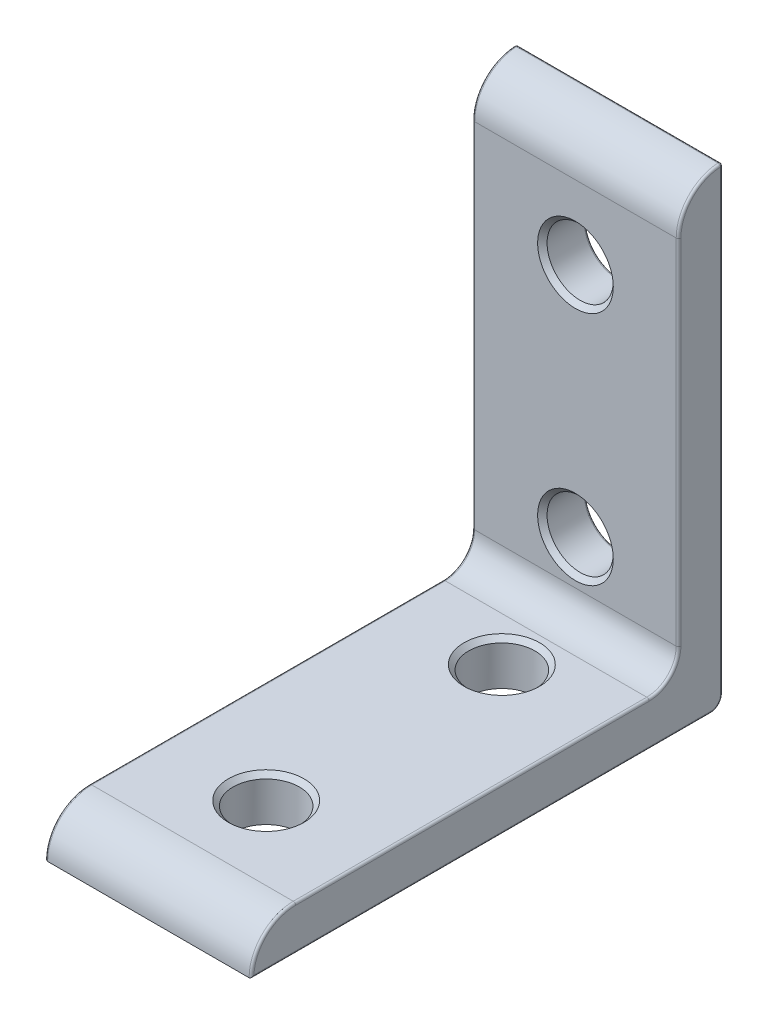
ISO-10303-21;
HEADER;
FILE_DESCRIPTION(('STEP AP214'),'2;1');
FILE_NAME('part.step','',(''),(''),'','','');
FILE_SCHEMA(('AUTOMOTIVE_DESIGN { 1 0 10303 214 1 1 1 1 }'));
ENDSEC;
DATA;
#1=APPLICATION_CONTEXT('core data for automotive mechanical design processes');
#2=APPLICATION_PROTOCOL_DEFINITION('international standard','automotive_design',2000,#1);
#3=PRODUCT_CONTEXT('',#1,'mechanical');
#4=PRODUCT('Part','Part','',(#3));
#5=PRODUCT_RELATED_PRODUCT_CATEGORY('part','',(#4));
#6=PRODUCT_DEFINITION_FORMATION('','',#4);
#7=PRODUCT_DEFINITION_CONTEXT('part definition',#1,'design');
#8=PRODUCT_DEFINITION('design','',#6,#7);
#9=PRODUCT_DEFINITION_SHAPE('','',#8);
#10=(LENGTH_UNIT() NAMED_UNIT(*) SI_UNIT(.MILLI.,.METRE.));
#11=(NAMED_UNIT(*) PLANE_ANGLE_UNIT() SI_UNIT($,.RADIAN.));
#12=(NAMED_UNIT(*) SI_UNIT($,.STERADIAN.) SOLID_ANGLE_UNIT());
#13=UNCERTAINTY_MEASURE_WITH_UNIT(LENGTH_MEASURE(1.E-05),#10,'distance_accuracy_value','');
#14=(GEOMETRIC_REPRESENTATION_CONTEXT(3) GLOBAL_UNCERTAINTY_ASSIGNED_CONTEXT((#13)) GLOBAL_UNIT_ASSIGNED_CONTEXT((#10,
#11,#12)) REPRESENTATION_CONTEXT('',''));
#15=CARTESIAN_POINT('',(0.,0.,0.));
#16=DIRECTION('',(0.,0.,1.));
#17=DIRECTION('',(1.,0.,0.));
#18=AXIS2_PLACEMENT_3D('',#15,#16,#17);
#19=CARTESIAN_POINT('',(-11.1125,-25.4,41.275));
#20=DIRECTION('',(1.,0.,0.));
#21=DIRECTION('',(0.,0.,-1.));
#22=AXIS2_PLACEMENT_3D('',#19,#20,#21);
#23=CYLINDRICAL_SURFACE('',#22,4.7625);
#24=DIRECTION('',(1.,0.,0.));
#25=VECTOR('',#24,1.);
#26=CARTESIAN_POINT('',(-11.1125,-20.6375,41.275));
#27=LINE('',#26,#25);
#28=CARTESIAN_POINT('',(-10.8585,-20.6375,41.275));
#29=VERTEX_POINT('',#28);
#30=CARTESIAN_POINT('',(10.8585,-20.6375,41.275));
#31=VERTEX_POINT('',#30);
#32=EDGE_CURVE('E203',#29,#31,#27,.T.);
#33=ORIENTED_EDGE('',*,*,#32,.F.);
#34=CARTESIAN_POINT('',(-10.8585,-25.4,41.275));
#35=DIRECTION('',(1.,0.,0.));
#36=DIRECTION('',(0.,0.,-1.));
#37=AXIS2_PLACEMENT_3D('',#34,#35,#36);
#38=CIRCLE('',#37,4.7625);
#39=CARTESIAN_POINT('',(-10.8585,-25.4,46.0375));
#40=VERTEX_POINT('',#39);
#41=EDGE_CURVE('E317',#29,#40,#38,.T.);
#42=ORIENTED_EDGE('',*,*,#41,.T.);
#43=DIRECTION('',(1.,0.,0.));
#44=VECTOR('',#43,1.);
#45=CARTESIAN_POINT('',(-11.1125,-25.4,46.0375));
#46=LINE('',#45,#44);
#47=CARTESIAN_POINT('',(10.8585,-25.4,46.0375));
#48=VERTEX_POINT('',#47);
#49=EDGE_CURVE('E193',#40,#48,#46,.T.);
#50=ORIENTED_EDGE('',*,*,#49,.T.);
#51=CARTESIAN_POINT('',(10.8585,-25.4,41.275));
#52=DIRECTION('',(1.,0.,0.));
#53=DIRECTION('',(0.,0.,-1.));
#54=AXIS2_PLACEMENT_3D('',#51,#52,#53);
#55=CIRCLE('',#54,4.7625);
#56=EDGE_CURVE('E314',#48,#31,#55,.F.);
#57=ORIENTED_EDGE('',*,*,#56,.T.);
#58=EDGE_LOOP('',(#33,#42,#50,#57));
#59=FACE_BOUND('',#58,.T.);
#60=ADVANCED_FACE('F41',(#59),#23,.T.);
#61=CARTESIAN_POINT('',(-11.1125,-20.6375,3.17499999999999));
#62=DIRECTION('',(0.,1.,0.));
#63=DIRECTION('',(0.,0.,1.));
#64=AXIS2_PLACEMENT_3D('',#61,#62,#63);
#65=PLANE('',#64);
#66=CARTESIAN_POINT('',(0.,-20.6375,33.3375));
#67=DIRECTION('',(0.,1.,0.));
#68=DIRECTION('',(0.,0.,1.));
#69=AXIS2_PLACEMENT_3D('',#66,#67,#68);
#70=CIRCLE('',#69,4.07670000000001);
#71=CARTESIAN_POINT('',(0.,-20.6375,37.4142));
#72=VERTEX_POINT('',#71);
#73=EDGE_CURVE('E247',#72,#72,#70,.F.);
#74=ORIENTED_EDGE('',*,*,#73,.T.);
#75=EDGE_LOOP('',(#74));
#76=FACE_BOUND('',#75,.T.);
#77=CARTESIAN_POINT('',(0.,-20.6375,7.9375));
#78=DIRECTION('',(0.,1.,0.));
#79=DIRECTION('',(0.,0.,1.));
#80=AXIS2_PLACEMENT_3D('',#77,#78,#79);
#81=CIRCLE('',#80,4.07670000000001);
#82=CARTESIAN_POINT('',(0.,-20.6375,12.0142));
#83=VERTEX_POINT('',#82);
#84=EDGE_CURVE('E243',#83,#83,#81,.F.);
#85=ORIENTED_EDGE('',*,*,#84,.T.);
#86=EDGE_LOOP('',(#85));
#87=FACE_BOUND('',#86,.T.);
#88=DIRECTION('',(1.,0.,0.));
#89=VECTOR('',#88,1.);
#90=CARTESIAN_POINT('',(-11.1125,-20.6375,3.17499999999999));
#91=LINE('',#90,#89);
#92=CARTESIAN_POINT('',(-10.8585,-20.6375,3.17499999999999));
#93=VERTEX_POINT('',#92);
#94=CARTESIAN_POINT('',(10.8585,-20.6375,3.17499999999999));
#95=VERTEX_POINT('',#94);
#96=EDGE_CURVE('E211',#93,#95,#91,.T.);
#97=ORIENTED_EDGE('',*,*,#96,.F.);
#98=DIRECTION('',(0.,0.,1.));
#99=VECTOR('',#98,1.);
#100=CARTESIAN_POINT('',(-10.8585,-20.6375,41.275));
#101=LINE('',#100,#99);
#102=EDGE_CURVE('E323',#93,#29,#101,.T.);
#103=ORIENTED_EDGE('',*,*,#102,.T.);
#104=ORIENTED_EDGE('',*,*,#32,.T.);
#105=DIRECTION('',(0.,0.,1.));
#106=VECTOR('',#105,1.);
#107=CARTESIAN_POINT('',(10.8585,-20.6375,3.17499999999999));
#108=LINE('',#107,#106);
#109=EDGE_CURVE('E320',#31,#95,#108,.F.);
#110=ORIENTED_EDGE('',*,*,#109,.T.);
#111=EDGE_LOOP('',(#97,#103,#104,#110));
#112=FACE_BOUND('',#111,.T.);
#113=ADVANCED_FACE('F551',(#76,#87,#112),#65,.T.);
#114=CARTESIAN_POINT('',(-11.1125,-17.4625,3.17499999999999));
#115=DIRECTION('',(1.,0.,0.));
#116=DIRECTION('',(0.,0.,-1.));
#117=AXIS2_PLACEMENT_3D('',#114,#115,#116);
#118=CYLINDRICAL_SURFACE('',#117,3.175);
#119=DIRECTION('',(1.,0.,0.));
#120=VECTOR('',#119,1.);
#121=CARTESIAN_POINT('',(-11.1125,-17.4625,0.));
#122=LINE('',#121,#120);
#123=CARTESIAN_POINT('',(-10.8585,-17.4625,0.));
#124=VERTEX_POINT('',#123);
#125=CARTESIAN_POINT('',(10.8585,-17.4625,0.));
#126=VERTEX_POINT('',#125);
#127=EDGE_CURVE('E556',#124,#126,#122,.T.);
#128=ORIENTED_EDGE('',*,*,#127,.F.);
#129=CARTESIAN_POINT('',(-10.8585,-17.4625,3.17499999999999));
#130=DIRECTION('',(1.,0.,0.));
#131=DIRECTION('',(0.,0.,-1.));
#132=AXIS2_PLACEMENT_3D('',#129,#130,#131);
#133=CIRCLE('',#132,3.175);
#134=EDGE_CURVE('E329',#124,#93,#133,.F.);
#135=ORIENTED_EDGE('',*,*,#134,.T.);
#136=ORIENTED_EDGE('',*,*,#96,.T.);
#137=CARTESIAN_POINT('',(10.8585,-17.4625,3.17499999999999));
#138=DIRECTION('',(1.,0.,0.));
#139=DIRECTION('',(0.,0.,-1.));
#140=AXIS2_PLACEMENT_3D('',#137,#138,#139);
#141=CIRCLE('',#140,3.175);
#142=EDGE_CURVE('E326',#95,#126,#141,.T.);
#143=ORIENTED_EDGE('',*,*,#142,.T.);
#144=EDGE_LOOP('',(#128,#135,#136,#143));
#145=FACE_BOUND('',#144,.T.);
#146=ADVANCED_FACE('F596',(#145),#118,.F.);
#147=CARTESIAN_POINT('',(-11.1125,20.6375,0.));
#148=DIRECTION('',(0.,0.,1.));
#149=DIRECTION('',(0.,-1.,0.));
#150=AXIS2_PLACEMENT_3D('',#147,#148,#149);
#151=PLANE('',#150);
#152=CARTESIAN_POINT('',(0.,12.7,0.));
#153=DIRECTION('',(0.,0.,1.));
#154=DIRECTION('',(0.,-1.,0.));
#155=AXIS2_PLACEMENT_3D('',#152,#153,#154);
#156=CIRCLE('',#155,4.0767);
#157=CARTESIAN_POINT('',(0.,8.62330000000001,0.));
#158=VERTEX_POINT('',#157);
#159=EDGE_CURVE('E231',#158,#158,#156,.F.);
#160=ORIENTED_EDGE('',*,*,#159,.T.);
#161=EDGE_LOOP('',(#160));
#162=FACE_BOUND('',#161,.T.);
#163=CARTESIAN_POINT('',(0.,-12.7,0.));
#164=DIRECTION('',(0.,0.,1.));
#165=DIRECTION('',(0.,-1.,0.));
#166=AXIS2_PLACEMENT_3D('',#163,#164,#165);
#167=CIRCLE('',#166,4.07670000000001);
#168=CARTESIAN_POINT('',(0.,-16.7767,0.));
#169=VERTEX_POINT('',#168);
#170=EDGE_CURVE('E227',#169,#169,#167,.F.);
#171=ORIENTED_EDGE('',*,*,#170,.T.);
#172=EDGE_LOOP('',(#171));
#173=FACE_BOUND('',#172,.T.);
#174=DIRECTION('',(1.,0.,0.));
#175=VECTOR('',#174,1.);
#176=CARTESIAN_POINT('',(-11.1125,20.6375,0.));
#177=LINE('',#176,#175);
#178=CARTESIAN_POINT('',(-10.8585,20.6375,0.));
#179=VERTEX_POINT('',#178);
#180=CARTESIAN_POINT('',(10.8585,20.6375,0.));
#181=VERTEX_POINT('',#180);
#182=EDGE_CURVE('E561',#179,#181,#177,.T.);
#183=ORIENTED_EDGE('',*,*,#182,.F.);
#184=DIRECTION('',(0.,-1.,0.));
#185=VECTOR('',#184,1.);
#186=CARTESIAN_POINT('',(-10.8585,-17.4625,0.));
#187=LINE('',#186,#185);
#188=EDGE_CURVE('E11',#179,#124,#187,.T.);
#189=ORIENTED_EDGE('',*,*,#188,.T.);
#190=ORIENTED_EDGE('',*,*,#127,.T.);
#191=DIRECTION('',(0.,-1.,0.));
#192=VECTOR('',#191,1.);
#193=CARTESIAN_POINT('',(10.8585,20.6375,0.));
#194=LINE('',#193,#192);
#195=EDGE_CURVE('E51',#126,#181,#194,.F.);
#196=ORIENTED_EDGE('',*,*,#195,.T.);
#197=EDGE_LOOP('',(#183,#189,#190,#196));
#198=FACE_BOUND('',#197,.T.);
#199=ADVANCED_FACE('F598',(#162,#173,#198),#151,.T.);
#200=CARTESIAN_POINT('',(-11.1125,20.6375,-4.7625));
#201=DIRECTION('',(1.,0.,0.));
#202=DIRECTION('',(0.,0.,-1.));
#203=AXIS2_PLACEMENT_3D('',#200,#201,#202);
#204=CYLINDRICAL_SURFACE('',#203,4.7625);
#205=DIRECTION('',(1.,0.,0.));
#206=VECTOR('',#205,1.);
#207=CARTESIAN_POINT('',(-11.1125,25.39243596902,-4.49419014084507));
#208=LINE('',#207,#206);
#209=CARTESIAN_POINT('',(10.8585,25.39243596902,-4.49419014084507));
#210=VERTEX_POINT('',#209);
#211=CARTESIAN_POINT('',(-10.8585,25.39243596902,-4.49419014084507));
#212=VERTEX_POINT('',#211);
#213=EDGE_CURVE('E305',#210,#212,#208,.F.);
#214=ORIENTED_EDGE('',*,*,#213,.T.);
#215=CARTESIAN_POINT('',(-10.8585,20.6375,-4.7625));
#216=DIRECTION('',(1.,0.,0.));
#217=DIRECTION('',(0.,0.,-1.));
#218=AXIS2_PLACEMENT_3D('',#215,#216,#217);
#219=CIRCLE('',#218,4.7625);
#220=EDGE_CURVE('E311',#212,#179,#219,.T.);
#221=ORIENTED_EDGE('',*,*,#220,.T.);
#222=ORIENTED_EDGE('',*,*,#182,.T.);
#223=CARTESIAN_POINT('',(10.8585,20.6375,-4.7625));
#224=DIRECTION('',(1.,0.,0.));
#225=DIRECTION('',(0.,0.,-1.));
#226=AXIS2_PLACEMENT_3D('',#223,#224,#225);
#227=CIRCLE('',#226,4.7625);
#228=EDGE_CURVE('E308',#181,#210,#227,.F.);
#229=ORIENTED_EDGE('',*,*,#228,.T.);
#230=EDGE_LOOP('',(#214,#221,#222,#229));
#231=FACE_BOUND('',#230,.T.);
#232=ADVANCED_FACE('F602',(#231),#204,.T.);
#233=CARTESIAN_POINT('',(-11.1125,-25.4,-4.7625));
#234=DIRECTION('',(0.,0.,-1.));
#235=DIRECTION('',(0.,1.,0.));
#236=AXIS2_PLACEMENT_3D('',#233,#234,#235);
#237=PLANE('',#236);
#238=CARTESIAN_POINT('',(0.,-12.7,-4.7625));
#239=DIRECTION('',(0.,0.,-1.));
#240=DIRECTION('',(0.,1.,0.));
#241=AXIS2_PLACEMENT_3D('',#238,#239,#240);
#242=CIRCLE('',#241,3.8227);
#243=CARTESIAN_POINT('',(0.,-8.8773,-4.7625));
#244=VERTEX_POINT('',#243);
#245=EDGE_CURVE('E336',#244,#244,#242,.F.);
#246=ORIENTED_EDGE('',*,*,#245,.T.);
#247=EDGE_LOOP('',(#246));
#248=FACE_BOUND('',#247,.T.);
#249=CARTESIAN_POINT('',(0.,12.7,-4.7625));
#250=DIRECTION('',(0.,0.,-1.));
#251=DIRECTION('',(0.,1.,0.));
#252=AXIS2_PLACEMENT_3D('',#249,#250,#251);
#253=CIRCLE('',#252,3.8227);
#254=CARTESIAN_POINT('',(0.,16.5227,-4.7625));
#255=VERTEX_POINT('',#254);
#256=EDGE_CURVE('E332',#255,#255,#253,.F.);
#257=ORIENTED_EDGE('',*,*,#256,.T.);
#258=EDGE_LOOP('',(#257));
#259=FACE_BOUND('',#258,.T.);
#260=DIRECTION('',(1.,0.,0.));
#261=VECTOR('',#260,1.);
#262=CARTESIAN_POINT('',(-11.1125,-24.1284125,-4.7625));
#263=LINE('',#262,#261);
#264=CARTESIAN_POINT('',(10.8585,-24.1284125,-4.7625));
#265=VERTEX_POINT('',#264);
#266=CARTESIAN_POINT('',(-10.8585,-24.1284125,-4.7625));
#267=VERTEX_POINT('',#266);
#268=EDGE_CURVE('E202',#265,#267,#263,.F.);
#269=ORIENTED_EDGE('',*,*,#268,.T.);
#270=DIRECTION('',(0.,1.,0.));
#271=VECTOR('',#270,1.);
#272=CARTESIAN_POINT('',(-10.8585,25.4,-4.7625));
#273=LINE('',#272,#271);
#274=CARTESIAN_POINT('',(-10.8585,25.1388393840056,-4.7625));
#275=VERTEX_POINT('',#274);
#276=EDGE_CURVE('E59',#267,#275,#273,.T.);
#277=ORIENTED_EDGE('',*,*,#276,.T.);
#278=DIRECTION('',(1.,0.,0.));
#279=VECTOR('',#278,1.);
#280=CARTESIAN_POINT('',(-11.1125,25.1388393840056,-4.7625));
#281=LINE('',#280,#279);
#282=CARTESIAN_POINT('',(10.8585,25.1388393840056,-4.7625));
#283=VERTEX_POINT('',#282);
#284=EDGE_CURVE('E63',#275,#283,#281,.T.);
#285=ORIENTED_EDGE('',*,*,#284,.T.);
#286=DIRECTION('',(0.,1.,0.));
#287=VECTOR('',#286,1.);
#288=CARTESIAN_POINT('',(10.8585,-25.4,-4.7625));
#289=LINE('',#288,#287);
#290=EDGE_CURVE('E340',#283,#265,#289,.F.);
#291=ORIENTED_EDGE('',*,*,#290,.T.);
#292=EDGE_LOOP('',(#269,#277,#285,#291));
#293=FACE_BOUND('',#292,.T.);
#294=ADVANCED_FACE('F534',(#248,#259,#293),#237,.T.);
#295=CARTESIAN_POINT('',(-11.1125,-25.4,46.0375));
#296=DIRECTION('',(0.,-1.,0.));
#297=DIRECTION('',(0.,0.,-1.));
#298=AXIS2_PLACEMENT_3D('',#295,#296,#297);
#299=PLANE('',#298);
#300=CARTESIAN_POINT('',(0.,-25.4,7.9375));
#301=DIRECTION('',(0.,-1.,0.));
#302=DIRECTION('',(0.,0.,-1.));
#303=AXIS2_PLACEMENT_3D('',#300,#301,#302);
#304=CIRCLE('',#303,3.5687);
#305=CARTESIAN_POINT('',(0.,-25.4,4.3688));
#306=VERTEX_POINT('',#305);
#307=EDGE_CURVE('E220',#306,#306,#304,.T.);
#308=ORIENTED_EDGE('',*,*,#307,.F.);
#309=EDGE_LOOP('',(#308));
#310=FACE_BOUND('',#309,.T.);
#311=CARTESIAN_POINT('',(0.,-25.4,33.3375));
#312=DIRECTION('',(0.,-1.,0.));
#313=DIRECTION('',(0.,0.,-1.));
#314=AXIS2_PLACEMENT_3D('',#311,#312,#313);
#315=CIRCLE('',#314,3.5687);
#316=CARTESIAN_POINT('',(0.,-25.4,29.7688));
#317=VERTEX_POINT('',#316);
#318=EDGE_CURVE('E216',#317,#317,#315,.T.);
#319=ORIENTED_EDGE('',*,*,#318,.F.);
#320=EDGE_LOOP('',(#319));
#321=FACE_BOUND('',#320,.T.);
#322=ORIENTED_EDGE('',*,*,#49,.F.);
#323=DIRECTION('',(0.,0.,-1.));
#324=VECTOR('',#323,1.);
#325=CARTESIAN_POINT('',(-10.8585,-25.4,-3.4909125));
#326=LINE('',#325,#324);
#327=CARTESIAN_POINT('',(-10.8585,-25.4,-3.4909125));
#328=VERTEX_POINT('',#327);
#329=EDGE_CURVE('E166',#40,#328,#326,.T.);
#330=ORIENTED_EDGE('',*,*,#329,.T.);
#331=DIRECTION('',(1.,0.,0.));
#332=VECTOR('',#331,1.);
#333=CARTESIAN_POINT('',(-11.1125,-25.4,-3.4909125));
#334=LINE('',#333,#332);
#335=CARTESIAN_POINT('',(10.8585,-25.4,-3.4909125));
#336=VERTEX_POINT('',#335);
#337=EDGE_CURVE('E190',#328,#336,#334,.T.);
#338=ORIENTED_EDGE('',*,*,#337,.T.);
#339=DIRECTION('',(0.,0.,-1.));
#340=VECTOR('',#339,1.);
#341=CARTESIAN_POINT('',(10.8585,-25.4,46.0375));
#342=LINE('',#341,#340);
#343=EDGE_CURVE('E197',#336,#48,#342,.F.);
#344=ORIENTED_EDGE('',*,*,#343,.T.);
#345=EDGE_LOOP('',(#322,#330,#338,#344));
#346=FACE_BOUND('',#345,.T.);
#347=ADVANCED_FACE('F189',(#310,#321,#346),#299,.T.);
#348=CARTESIAN_POINT('',(-11.1125,-25.4,41.275));
#349=DIRECTION('',(1.,0.,0.));
#350=DIRECTION('',(0.,0.,-1.));
#351=AXIS2_PLACEMENT_3D('',#348,#349,#350);
#352=PLANE('',#351);
#353=DIRECTION('',(0.,1.,0.));
#354=VECTOR('',#353,1.);
#355=CARTESIAN_POINT('',(-11.1125,-24.1284125,-4.5085));
#356=LINE('',#355,#354);
#357=CARTESIAN_POINT('',(-11.1125,25.1388393840056,-4.5085));
#358=VERTEX_POINT('',#357);
#359=CARTESIAN_POINT('',(-11.1125,-24.1284125,-4.5085));
#360=VERTEX_POINT('',#359);
#361=EDGE_CURVE('E273',#358,#360,#356,.F.);
#362=ORIENTED_EDGE('',*,*,#361,.T.);
#363=CARTESIAN_POINT('',(-11.1125,-24.1284125,-3.4909125));
#364=DIRECTION('',(1.,0.,0.));
#365=DIRECTION('',(0.,0.,-1.));
#366=AXIS2_PLACEMENT_3D('',#363,#364,#365);
#367=CIRCLE('',#366,1.0175875);
#368=CARTESIAN_POINT('',(-11.1125,-25.146,-3.4909125));
#369=VERTEX_POINT('',#368);
#370=EDGE_CURVE('E276',#360,#369,#367,.F.);
#371=ORIENTED_EDGE('',*,*,#370,.T.);
#372=DIRECTION('',(0.,0.,-1.));
#373=VECTOR('',#372,1.);
#374=CARTESIAN_POINT('',(-11.1125,-25.146,46.0375));
#375=LINE('',#374,#373);
#376=CARTESIAN_POINT('',(-11.1125,-25.146,45.7763393840056));
#377=VERTEX_POINT('',#376);
#378=EDGE_CURVE('E168',#369,#377,#375,.F.);
#379=ORIENTED_EDGE('',*,*,#378,.T.);
#380=CARTESIAN_POINT('',(-11.1125,-25.4,41.275));
#381=DIRECTION('',(1.,0.,0.));
#382=DIRECTION('',(0.,0.,-1.));
#383=AXIS2_PLACEMENT_3D('',#380,#381,#382);
#384=CIRCLE('',#383,4.5085);
#385=CARTESIAN_POINT('',(-11.1125,-20.8915,41.275));
#386=VERTEX_POINT('',#385);
#387=EDGE_CURVE('E265',#377,#386,#384,.F.);
#388=ORIENTED_EDGE('',*,*,#387,.T.);
#389=DIRECTION('',(0.,0.,1.));
#390=VECTOR('',#389,1.);
#391=CARTESIAN_POINT('',(-11.1125,-20.8915,3.17499999999999));
#392=LINE('',#391,#390);
#393=CARTESIAN_POINT('',(-11.1125,-20.8915,3.17499999999999));
#394=VERTEX_POINT('',#393);
#395=EDGE_CURVE('E262',#386,#394,#392,.F.);
#396=ORIENTED_EDGE('',*,*,#395,.T.);
#397=CARTESIAN_POINT('',(-11.1125,-17.4625,3.17499999999999));
#398=DIRECTION('',(1.,0.,0.));
#399=DIRECTION('',(0.,0.,-1.));
#400=AXIS2_PLACEMENT_3D('',#397,#398,#399);
#401=CIRCLE('',#400,3.429);
#402=CARTESIAN_POINT('',(-11.1125,-17.4625,-0.254000000000005));
#403=VERTEX_POINT('',#402);
#404=EDGE_CURVE('E259',#394,#403,#401,.T.);
#405=ORIENTED_EDGE('',*,*,#404,.T.);
#406=DIRECTION('',(0.,-1.,0.));
#407=VECTOR('',#406,1.);
#408=CARTESIAN_POINT('',(-11.1125,20.6375,-0.254000000000002));
#409=LINE('',#408,#407);
#410=CARTESIAN_POINT('',(-11.1125,20.6375,-0.254000000000002));
#411=VERTEX_POINT('',#410);
#412=EDGE_CURVE('E196',#403,#411,#409,.F.);
#413=ORIENTED_EDGE('',*,*,#412,.T.);
#414=CARTESIAN_POINT('',(-11.1125,20.6375,-4.7625));
#415=DIRECTION('',(1.,0.,0.));
#416=DIRECTION('',(0.,0.,-1.));
#417=AXIS2_PLACEMENT_3D('',#414,#415,#416);
#418=CIRCLE('',#417,4.5085);
#419=EDGE_CURVE('E268',#411,#358,#418,.F.);
#420=ORIENTED_EDGE('',*,*,#419,.T.);
#421=EDGE_LOOP('',(#362,#371,#379,#388,#396,#405,#413,#420));
#422=FACE_BOUND('',#421,.T.);
#423=ADVANCED_FACE('F516',(#422),#352,.F.);
#424=CARTESIAN_POINT('',(11.1125,-25.4,41.275));
#425=DIRECTION('',(1.,0.,0.));
#426=DIRECTION('',(0.,0.,-1.));
#427=AXIS2_PLACEMENT_3D('',#424,#425,#426);
#428=PLANE('',#427);
#429=DIRECTION('',(0.,0.,-1.));
#430=VECTOR('',#429,1.);
#431=CARTESIAN_POINT('',(11.1125,-25.146,41.275));
#432=LINE('',#431,#430);
#433=CARTESIAN_POINT('',(11.1125,-25.146,45.7763393840056));
#434=VERTEX_POINT('',#433);
#435=CARTESIAN_POINT('',(11.1125,-25.146,-3.4909125));
#436=VERTEX_POINT('',#435);
#437=EDGE_CURVE('E295',#434,#436,#432,.T.);
#438=ORIENTED_EDGE('',*,*,#437,.T.);
#439=CARTESIAN_POINT('',(11.1125,-24.1284125,-3.4909125));
#440=DIRECTION('',(1.,0.,0.));
#441=DIRECTION('',(0.,0.,-1.));
#442=AXIS2_PLACEMENT_3D('',#439,#440,#441);
#443=CIRCLE('',#442,1.0175875);
#444=CARTESIAN_POINT('',(11.1125,-24.1284125,-4.5085));
#445=VERTEX_POINT('',#444);
#446=EDGE_CURVE('E302',#436,#445,#443,.T.);
#447=ORIENTED_EDGE('',*,*,#446,.T.);
#448=DIRECTION('',(0.,1.,0.));
#449=VECTOR('',#448,1.);
#450=CARTESIAN_POINT('',(11.1125,-25.4,-4.5085));
#451=LINE('',#450,#449);
#452=CARTESIAN_POINT('',(11.1125,25.1388393840056,-4.5085));
#453=VERTEX_POINT('',#452);
#454=EDGE_CURVE('E299',#445,#453,#451,.T.);
#455=ORIENTED_EDGE('',*,*,#454,.T.);
#456=CARTESIAN_POINT('',(11.1125,20.6375,-4.7625));
#457=DIRECTION('',(1.,0.,0.));
#458=DIRECTION('',(0.,0.,-1.));
#459=AXIS2_PLACEMENT_3D('',#456,#457,#458);
#460=CIRCLE('',#459,4.5085);
#461=CARTESIAN_POINT('',(11.1125,20.6375,-0.254000000000007));
#462=VERTEX_POINT('',#461);
#463=EDGE_CURVE('E292',#453,#462,#460,.T.);
#464=ORIENTED_EDGE('',*,*,#463,.T.);
#465=DIRECTION('',(0.,-1.,0.));
#466=VECTOR('',#465,1.);
#467=CARTESIAN_POINT('',(11.1125,-25.4,-0.254000000000011));
#468=LINE('',#467,#466);
#469=CARTESIAN_POINT('',(11.1125,-17.4625,-0.25400000000001));
#470=VERTEX_POINT('',#469);
#471=EDGE_CURVE('E183',#462,#470,#468,.T.);
#472=ORIENTED_EDGE('',*,*,#471,.T.);
#473=CARTESIAN_POINT('',(11.1125,-17.4625,3.17499999999999));
#474=DIRECTION('',(1.,0.,0.));
#475=DIRECTION('',(0.,0.,-1.));
#476=AXIS2_PLACEMENT_3D('',#473,#474,#475);
#477=CIRCLE('',#476,3.429);
#478=CARTESIAN_POINT('',(11.1125,-20.8915,3.17499999999999));
#479=VERTEX_POINT('',#478);
#480=EDGE_CURVE('E283',#470,#479,#477,.F.);
#481=ORIENTED_EDGE('',*,*,#480,.T.);
#482=DIRECTION('',(0.,0.,1.));
#483=VECTOR('',#482,1.);
#484=CARTESIAN_POINT('',(11.1125,-20.8915,41.275));
#485=LINE('',#484,#483);
#486=CARTESIAN_POINT('',(11.1125,-20.8915,41.275));
#487=VERTEX_POINT('',#486);
#488=EDGE_CURVE('E286',#479,#487,#485,.T.);
#489=ORIENTED_EDGE('',*,*,#488,.T.);
#490=CARTESIAN_POINT('',(11.1125,-25.4,41.275));
#491=DIRECTION('',(1.,0.,0.));
#492=DIRECTION('',(0.,0.,-1.));
#493=AXIS2_PLACEMENT_3D('',#490,#491,#492);
#494=CIRCLE('',#493,4.5085);
#495=EDGE_CURVE('E289',#487,#434,#494,.T.);
#496=ORIENTED_EDGE('',*,*,#495,.T.);
#497=EDGE_LOOP('',(#438,#447,#455,#464,#472,#481,#489,#496));
#498=FACE_BOUND('',#497,.T.);
#499=ADVANCED_FACE('F539',(#498),#428,.T.);
#500=CARTESIAN_POINT('',(-11.1125,-24.1284125,-3.4909125));
#501=DIRECTION('',(1.,0.,0.));
#502=DIRECTION('',(0.,0.,-1.));
#503=AXIS2_PLACEMENT_3D('',#500,#501,#502);
#504=CYLINDRICAL_SURFACE('',#503,1.2715875);
#505=ORIENTED_EDGE('',*,*,#337,.F.);
#506=CARTESIAN_POINT('',(-10.8585,-24.1284125,-3.4909125));
#507=DIRECTION('',(1.,0.,0.));
#508=DIRECTION('',(0.,0.,-1.));
#509=AXIS2_PLACEMENT_3D('',#506,#507,#508);
#510=CIRCLE('',#509,1.2715875);
#511=EDGE_CURVE('E175',#328,#267,#510,.T.);
#512=ORIENTED_EDGE('',*,*,#511,.T.);
#513=ORIENTED_EDGE('',*,*,#268,.F.);
#514=CARTESIAN_POINT('',(10.8585,-24.1284125,-3.4909125));
#515=DIRECTION('',(1.,0.,0.));
#516=DIRECTION('',(0.,0.,-1.));
#517=AXIS2_PLACEMENT_3D('',#514,#515,#516);
#518=CIRCLE('',#517,1.2715875);
#519=EDGE_CURVE('E184',#265,#336,#518,.F.);
#520=ORIENTED_EDGE('',*,*,#519,.T.);
#521=EDGE_LOOP('',(#505,#512,#513,#520));
#522=FACE_BOUND('',#521,.T.);
#523=ADVANCED_FACE('F199',(#522),#504,.T.);
#524=CARTESIAN_POINT('',(0.,-12.7,-4.7625));
#525=DIRECTION('',(0.,0.,1.));
#526=DIRECTION('',(1.,0.,0.));
#527=AXIS2_PLACEMENT_3D('',#524,#525,#526);
#528=CYLINDRICAL_SURFACE('',#527,3.5687);
#529=CARTESIAN_POINT('',(0.,-12.7,-4.5085));
#530=DIRECTION('',(0.,0.,-1.));
#531=DIRECTION('',(0.,1.,0.));
#532=AXIS2_PLACEMENT_3D('',#529,#530,#531);
#533=CIRCLE('',#532,3.5687);
#534=CARTESIAN_POINT('',(0.,-9.1313,-4.5085));
#535=VERTEX_POINT('',#534);
#536=EDGE_CURVE('E347',#535,#535,#533,.T.);
#537=ORIENTED_EDGE('',*,*,#536,.T.);
#538=EDGE_LOOP('',(#537));
#539=FACE_BOUND('',#538,.T.);
#540=CARTESIAN_POINT('',(0.,-12.7,-0.508000000000003));
#541=DIRECTION('',(0.,0.,1.));
#542=DIRECTION('',(1.,0.,0.));
#543=AXIS2_PLACEMENT_3D('',#540,#541,#542);
#544=CIRCLE('',#543,3.5687);
#545=CARTESIAN_POINT('',(3.5687,-12.7,-0.508000000000003));
#546=VERTEX_POINT('',#545);
#547=EDGE_CURVE('E235',#546,#546,#544,.T.);
#548=ORIENTED_EDGE('',*,*,#547,.T.);
#549=EDGE_LOOP('',(#548));
#550=FACE_BOUND('',#549,.T.);
#551=ADVANCED_FACE('F624',(#539,#550),#528,.F.);
#552=CARTESIAN_POINT('',(0.,12.7,-4.7625));
#553=DIRECTION('',(0.,0.,1.));
#554=DIRECTION('',(1.,0.,0.));
#555=AXIS2_PLACEMENT_3D('',#552,#553,#554);
#556=CYLINDRICAL_SURFACE('',#555,3.5687);
#557=CARTESIAN_POINT('',(0.,12.7,-4.5085));
#558=DIRECTION('',(0.,0.,-1.));
#559=DIRECTION('',(0.,1.,0.));
#560=AXIS2_PLACEMENT_3D('',#557,#558,#559);
#561=CIRCLE('',#560,3.5687);
#562=CARTESIAN_POINT('',(0.,16.2687,-4.5085));
#563=VERTEX_POINT('',#562);
#564=EDGE_CURVE('E351',#563,#563,#561,.T.);
#565=ORIENTED_EDGE('',*,*,#564,.T.);
#566=EDGE_LOOP('',(#565));
#567=FACE_BOUND('',#566,.T.);
#568=CARTESIAN_POINT('',(0.,12.7,-0.507999999999994));
#569=DIRECTION('',(0.,0.,1.));
#570=DIRECTION('',(1.,0.,0.));
#571=AXIS2_PLACEMENT_3D('',#568,#569,#570);
#572=CIRCLE('',#571,3.5687);
#573=CARTESIAN_POINT('',(3.56870000000001,12.7,-0.507999999999994));
#574=VERTEX_POINT('',#573);
#575=EDGE_CURVE('E208',#574,#574,#572,.T.);
#576=ORIENTED_EDGE('',*,*,#575,.T.);
#577=EDGE_LOOP('',(#576));
#578=FACE_BOUND('',#577,.T.);
#579=ADVANCED_FACE('F656',(#567,#578),#556,.F.);
#580=CARTESIAN_POINT('',(0.,-28.5115,33.3375));
#581=DIRECTION('',(0.,1.,0.));
#582=DIRECTION('',(0.,0.,1.));
#583=AXIS2_PLACEMENT_3D('',#580,#581,#582);
#584=CYLINDRICAL_SURFACE('',#583,3.5687);
#585=CARTESIAN_POINT('',(0.,-21.1455,33.3375));
#586=DIRECTION('',(0.,1.,0.));
#587=DIRECTION('',(0.,0.,1.));
#588=AXIS2_PLACEMENT_3D('',#585,#586,#587);
#589=CIRCLE('',#588,3.5687);
#590=CARTESIAN_POINT('',(0.,-21.1455,36.9062));
#591=VERTEX_POINT('',#590);
#592=EDGE_CURVE('E239',#591,#591,#589,.T.);
#593=ORIENTED_EDGE('',*,*,#592,.T.);
#594=EDGE_LOOP('',(#593));
#595=FACE_BOUND('',#594,.T.);
#596=ORIENTED_EDGE('',*,*,#318,.T.);
#597=EDGE_LOOP('',(#596));
#598=FACE_BOUND('',#597,.T.);
#599=ADVANCED_FACE('F647',(#595,#598),#584,.F.);
#600=CARTESIAN_POINT('',(0.,-28.5115,7.9375));
#601=DIRECTION('',(0.,1.,0.));
#602=DIRECTION('',(0.,0.,1.));
#603=AXIS2_PLACEMENT_3D('',#600,#601,#602);
#604=CYLINDRICAL_SURFACE('',#603,3.5687);
#605=CARTESIAN_POINT('',(0.,-21.1455,7.9375));
#606=DIRECTION('',(0.,1.,0.));
#607=DIRECTION('',(0.,0.,1.));
#608=AXIS2_PLACEMENT_3D('',#605,#606,#607);
#609=CIRCLE('',#608,3.5687);
#610=CARTESIAN_POINT('',(0.,-21.1455,11.5062));
#611=VERTEX_POINT('',#610);
#612=EDGE_CURVE('E251',#611,#611,#609,.T.);
#613=ORIENTED_EDGE('',*,*,#612,.T.);
#614=EDGE_LOOP('',(#613));
#615=FACE_BOUND('',#614,.T.);
#616=ORIENTED_EDGE('',*,*,#307,.T.);
#617=EDGE_LOOP('',(#616));
#618=FACE_BOUND('',#617,.T.);
#619=ADVANCED_FACE('F629',(#615,#618),#604,.F.);
#620=CARTESIAN_POINT('',(0.,12.7,-0.507999999999994));
#621=DIRECTION('',(0.,0.,1.));
#622=DIRECTION('',(1.,0.,0.));
#623=AXIS2_PLACEMENT_3D('',#620,#621,#622);
#624=CONICAL_SURFACE('',#623,3.5687,0.785398163397448);
#625=ORIENTED_EDGE('',*,*,#159,.F.);
#626=EDGE_LOOP('',(#625));
#627=FACE_BOUND('',#626,.T.);
#628=ORIENTED_EDGE('',*,*,#575,.F.);
#629=EDGE_LOOP('',(#628));
#630=FACE_BOUND('',#629,.T.);
#631=ADVANCED_FACE('F625',(#627,#630),#624,.F.);
#632=CARTESIAN_POINT('',(0.,-12.7,-0.508000000000003));
#633=DIRECTION('',(0.,0.,1.));
#634=DIRECTION('',(1.,0.,0.));
#635=AXIS2_PLACEMENT_3D('',#632,#633,#634);
#636=CONICAL_SURFACE('',#635,3.5687,0.785398163397455);
#637=ORIENTED_EDGE('',*,*,#170,.F.);
#638=EDGE_LOOP('',(#637));
#639=FACE_BOUND('',#638,.T.);
#640=ORIENTED_EDGE('',*,*,#547,.F.);
#641=EDGE_LOOP('',(#640));
#642=FACE_BOUND('',#641,.T.);
#643=ADVANCED_FACE('F628',(#639,#642),#636,.F.);
#644=CARTESIAN_POINT('',(0.,-21.1455,33.3375));
#645=DIRECTION('',(0.,1.,0.));
#646=DIRECTION('',(0.,0.,1.));
#647=AXIS2_PLACEMENT_3D('',#644,#645,#646);
#648=CONICAL_SURFACE('',#647,3.5687,0.785398163397454);
#649=ORIENTED_EDGE('',*,*,#73,.F.);
#650=EDGE_LOOP('',(#649));
#651=FACE_BOUND('',#650,.T.);
#652=ORIENTED_EDGE('',*,*,#592,.F.);
#653=EDGE_LOOP('',(#652));
#654=FACE_BOUND('',#653,.T.);
#655=ADVANCED_FACE('F633',(#651,#654),#648,.F.);
#656=CARTESIAN_POINT('',(0.,-21.1455,7.9375));
#657=DIRECTION('',(0.,1.,0.));
#658=DIRECTION('',(0.,0.,1.));
#659=AXIS2_PLACEMENT_3D('',#656,#657,#658);
#660=CONICAL_SURFACE('',#659,3.5687,0.785398163397453);
#661=ORIENTED_EDGE('',*,*,#84,.F.);
#662=EDGE_LOOP('',(#661));
#663=FACE_BOUND('',#662,.T.);
#664=ORIENTED_EDGE('',*,*,#612,.F.);
#665=EDGE_LOOP('',(#664));
#666=FACE_BOUND('',#665,.T.);
#667=ADVANCED_FACE('F433',(#663,#666),#660,.F.);
#668=CARTESIAN_POINT('',(10.8585,-25.4,41.275));
#669=DIRECTION('',(1.,0.,0.));
#670=DIRECTION('',(0.,0.,-1.));
#671=AXIS2_PLACEMENT_3D('',#668,#669,#670);
#672=TOROIDAL_SURFACE('',#671,4.5085,0.254);
#673=CARTESIAN_POINT('',(10.8585,-25.4,46.0375));
#674=CARTESIAN_POINT('',(10.8698762313463,-25.4000192330531,46.037518605478));
#675=CARTESIAN_POINT('',(10.8812243433398,-25.3992370610143,46.0367370790178));
#676=CARTESIAN_POINT('',(10.9034379318322,-25.3962367440464,46.0337356496582));
#677=CARTESIAN_POINT('',(10.9143067021098,-25.394030917903,46.0315280860215));
#678=CARTESIAN_POINT('',(10.9353128643374,-25.3883526527001,46.0258391638067));
#679=CARTESIAN_POINT('',(10.9454521161424,-25.3848835819147,46.0223611925263));
#680=CARTESIAN_POINT('',(10.964871473307,-25.3768929506727,46.0143383362931));
#681=CARTESIAN_POINT('',(10.9741496290527,-25.3723690795751,46.0097911088435));
#682=CARTESIAN_POINT('',(10.9952782301381,-25.3604944400431,45.9978343217826));
#683=CARTESIAN_POINT('',(11.0066649199503,-25.3527380743674,45.9900086999704));
#684=CARTESIAN_POINT('',(11.0275236819516,-25.336068419049,45.9731410758718));
#685=CARTESIAN_POINT('',(11.0369920821123,-25.3271529631965,45.9640967948654));
#686=CARTESIAN_POINT('',(11.0575007321147,-25.3048300846396,45.9413783755965));
#687=CARTESIAN_POINT('',(11.0676711632514,-25.2910451765997,45.9272923043152));
#688=CARTESIAN_POINT('',(11.0847636788642,-25.2626043972422,45.8980863612544));
#689=CARTESIAN_POINT('',(11.0916814424291,-25.2479473963551,45.8829651447244));
#690=CARTESIAN_POINT('',(11.1021954092487,-25.2191339518849,45.8530854528278));
#691=CARTESIAN_POINT('',(11.1059728327848,-25.2050038283809,45.8383637758988));
#692=CARTESIAN_POINT('',(11.1110568087286,-25.1766307570436,45.8086557279928));
#693=CARTESIAN_POINT('',(11.1123681555787,-25.1623880823056,45.7936699279168));
#694=CARTESIAN_POINT('',(11.1124968444756,-25.1474608820799,45.7778848262677));
#695=CARTESIAN_POINT('',(11.1124999941532,-25.1467303720682,45.7771121323185));
#696=CARTESIAN_POINT('',(11.1125,-25.146,45.7763393840056));
#697=B_SPLINE_CURVE_WITH_KNOTS('',3,(#673,#674,#675,#676,#677,#678,#679,#680,#681,#682,#683,
#684,#685,#686,#687,#688,#689,#690,#691,#692,#693,#694,#695,#696),.UNSPECIFIED.,.F.,.F.,(4,2,2,
2,2,2,2,2,2,2,2,4),(0.,0.0340304929860746,0.0677704000257823,0.10142099504131,0.135146009207402,
0.18241763085485,0.229778903168415,0.295954845535662,0.36221845074715,0.424323163959806,
0.486307010478045,0.489497034274662),.UNSPECIFIED.);
#698=EDGE_CURVE('E437',#434,#48,#697,.F.);
#699=ORIENTED_EDGE('',*,*,#698,.F.);
#700=ORIENTED_EDGE('',*,*,#495,.F.);
#701=CARTESIAN_POINT('',(10.8585,-20.8915,41.275));
#702=DIRECTION('',(0.,0.,-1.));
#703=DIRECTION('',(-1.,0.,0.));
#704=AXIS2_PLACEMENT_3D('',#701,#702,#703);
#705=CIRCLE('',#704,0.254);
#706=EDGE_CURVE('E45',#31,#487,#705,.T.);
#707=ORIENTED_EDGE('',*,*,#706,.F.);
#708=ORIENTED_EDGE('',*,*,#56,.F.);
#709=EDGE_LOOP('',(#699,#700,#707,#708));
#710=FACE_BOUND('',#709,.T.);
#711=ADVANCED_FACE('F428',(#710),#672,.T.);
#712=CARTESIAN_POINT('',(10.8585,-20.8915,41.275));
#713=DIRECTION('',(0.,0.,1.));
#714=DIRECTION('',(0.,-1.,0.));
#715=AXIS2_PLACEMENT_3D('',#712,#713,#714);
#716=CYLINDRICAL_SURFACE('',#715,0.254);
#717=ORIENTED_EDGE('',*,*,#706,.T.);
#718=ORIENTED_EDGE('',*,*,#488,.F.);
#719=CARTESIAN_POINT('',(10.8585,-20.8915,3.17499999999999));
#720=DIRECTION('',(0.,0.,-1.));
#721=DIRECTION('',(-1.,0.,0.));
#722=AXIS2_PLACEMENT_3D('',#719,#720,#721);
#723=CIRCLE('',#722,0.254);
#724=EDGE_CURVE('E445',#95,#479,#723,.T.);
#725=ORIENTED_EDGE('',*,*,#724,.F.);
#726=ORIENTED_EDGE('',*,*,#109,.F.);
#727=EDGE_LOOP('',(#717,#718,#725,#726));
#728=FACE_BOUND('',#727,.T.);
#729=ADVANCED_FACE('F432',(#728),#716,.T.);
#730=CARTESIAN_POINT('',(10.8585,-25.146,41.275));
#731=DIRECTION('',(0.,0.,-1.));
#732=DIRECTION('',(-1.,0.,0.));
#733=AXIS2_PLACEMENT_3D('',#730,#731,#732);
#734=CYLINDRICAL_SURFACE('',#733,0.254);
#735=ORIENTED_EDGE('',*,*,#698,.T.);
#736=ORIENTED_EDGE('',*,*,#343,.F.);
#737=CARTESIAN_POINT('',(10.8585,-25.146,-3.4909125));
#738=DIRECTION('',(0.,0.,-1.));
#739=DIRECTION('',(-1.,0.,0.));
#740=AXIS2_PLACEMENT_3D('',#737,#738,#739);
#741=CIRCLE('',#740,0.254);
#742=EDGE_CURVE('E449',#436,#336,#741,.T.);
#743=ORIENTED_EDGE('',*,*,#742,.F.);
#744=ORIENTED_EDGE('',*,*,#437,.F.);
#745=EDGE_LOOP('',(#735,#736,#743,#744));
#746=FACE_BOUND('',#745,.T.);
#747=ADVANCED_FACE('F426',(#746),#734,.T.);
#748=CARTESIAN_POINT('',(10.8585,-17.4625,3.17499999999999));
#749=DIRECTION('',(1.,0.,0.));
#750=DIRECTION('',(0.,0.,-1.));
#751=AXIS2_PLACEMENT_3D('',#748,#749,#750);
#752=TOROIDAL_SURFACE('',#751,3.429,0.254);
#753=ORIENTED_EDGE('',*,*,#724,.T.);
#754=ORIENTED_EDGE('',*,*,#480,.F.);
#755=CARTESIAN_POINT('',(10.8585,-17.4625,-0.254000000000004));
#756=DIRECTION('',(0.,1.,0.));
#757=DIRECTION('',(0.,0.,1.));
#758=AXIS2_PLACEMENT_3D('',#755,#756,#757);
#759=CIRCLE('',#758,0.254);
#760=EDGE_CURVE('E453',#126,#470,#759,.T.);
#761=ORIENTED_EDGE('',*,*,#760,.F.);
#762=ORIENTED_EDGE('',*,*,#142,.F.);
#763=EDGE_LOOP('',(#753,#754,#761,#762));
#764=FACE_BOUND('',#763,.T.);
#765=ADVANCED_FACE('F422',(#764),#752,.T.);
#766=CARTESIAN_POINT('',(10.8585,-24.1284125,-3.4909125));
#767=DIRECTION('',(1.,0.,0.));
#768=DIRECTION('',(0.,0.,-1.));
#769=AXIS2_PLACEMENT_3D('',#766,#767,#768);
#770=TOROIDAL_SURFACE('',#769,1.0175875,0.254);
#771=ORIENTED_EDGE('',*,*,#742,.T.);
#772=ORIENTED_EDGE('',*,*,#519,.F.);
#773=CARTESIAN_POINT('',(10.8585,-24.1284125,-4.5085));
#774=DIRECTION('',(0.,1.,0.));
#775=DIRECTION('',(0.,0.,1.));
#776=AXIS2_PLACEMENT_3D('',#773,#774,#775);
#777=CIRCLE('',#776,0.254);
#778=EDGE_CURVE('E457',#445,#265,#777,.T.);
#779=ORIENTED_EDGE('',*,*,#778,.F.);
#780=ORIENTED_EDGE('',*,*,#446,.F.);
#781=EDGE_LOOP('',(#771,#772,#779,#780));
#782=FACE_BOUND('',#781,.T.);
#783=ADVANCED_FACE('F418',(#782),#770,.T.);
#784=CARTESIAN_POINT('',(10.8585,-25.4,-0.254000000000011));
#785=DIRECTION('',(0.,-1.,0.));
#786=DIRECTION('',(0.,0.,-1.));
#787=AXIS2_PLACEMENT_3D('',#784,#785,#786);
#788=CYLINDRICAL_SURFACE('',#787,0.254);
#789=ORIENTED_EDGE('',*,*,#760,.T.);
#790=ORIENTED_EDGE('',*,*,#471,.F.);
#791=CARTESIAN_POINT('',(10.8585,20.6375,-0.254000000000002));
#792=DIRECTION('',(0.,1.,0.));
#793=DIRECTION('',(0.,0.,1.));
#794=AXIS2_PLACEMENT_3D('',#791,#792,#793);
#795=CIRCLE('',#794,0.254);
#796=EDGE_CURVE('E461',#181,#462,#795,.T.);
#797=ORIENTED_EDGE('',*,*,#796,.F.);
#798=ORIENTED_EDGE('',*,*,#195,.F.);
#799=EDGE_LOOP('',(#789,#790,#797,#798));
#800=FACE_BOUND('',#799,.T.);
#801=ADVANCED_FACE('F414',(#800),#788,.T.);
#802=CARTESIAN_POINT('',(10.8585,-25.4,-4.5085));
#803=DIRECTION('',(0.,1.,0.));
#804=DIRECTION('',(0.,0.,1.));
#805=AXIS2_PLACEMENT_3D('',#802,#803,#804);
#806=CYLINDRICAL_SURFACE('',#805,0.254);
#807=ORIENTED_EDGE('',*,*,#778,.T.);
#808=ORIENTED_EDGE('',*,*,#290,.F.);
#809=CARTESIAN_POINT('',(10.8585,25.1388393840056,-4.5085));
#810=DIRECTION('',(0.,1.,0.));
#811=DIRECTION('',(0.,0.,1.));
#812=AXIS2_PLACEMENT_3D('',#809,#810,#811);
#813=CIRCLE('',#812,0.254);
#814=EDGE_CURVE('E465',#453,#283,#813,.T.);
#815=ORIENTED_EDGE('',*,*,#814,.F.);
#816=ORIENTED_EDGE('',*,*,#454,.F.);
#817=EDGE_LOOP('',(#807,#808,#815,#816));
#818=FACE_BOUND('',#817,.T.);
#819=ADVANCED_FACE('F410',(#818),#806,.T.);
#820=CARTESIAN_POINT('',(10.8585,20.6375,-4.7625));
#821=DIRECTION('',(1.,0.,0.));
#822=DIRECTION('',(0.,0.,-1.));
#823=AXIS2_PLACEMENT_3D('',#820,#821,#822);
#824=TOROIDAL_SURFACE('',#823,4.5085,0.254);
#825=ORIENTED_EDGE('',*,*,#796,.T.);
#826=ORIENTED_EDGE('',*,*,#463,.F.);
#827=CARTESIAN_POINT('',(10.8585,25.1388393840056,-4.5085));
#828=DIRECTION('',(0.,0.0563380281690126,-0.998411752025199));
#829=DIRECTION('',(0.,0.998411752025199,0.0563380281690126));
#830=AXIS2_PLACEMENT_3D('',#827,#828,#829);
#831=CIRCLE('',#830,0.254);
#832=EDGE_CURVE('E469',#210,#453,#831,.T.);
#833=ORIENTED_EDGE('',*,*,#832,.F.);
#834=ORIENTED_EDGE('',*,*,#228,.F.);
#835=EDGE_LOOP('',(#825,#826,#833,#834));
#836=FACE_BOUND('',#835,.T.);
#837=ADVANCED_FACE('F406',(#836),#824,.T.);
#838=CARTESIAN_POINT('',(10.8585,25.1388393840056,-4.5085));
#839=DIRECTION('',(0.,0.,1.));
#840=DIRECTION('',(1.,0.,0.));
#841=AXIS2_PLACEMENT_3D('',#838,#839,#840);
#842=SPHERICAL_SURFACE('',#841,0.254);
#843=ORIENTED_EDGE('',*,*,#832,.T.);
#844=ORIENTED_EDGE('',*,*,#814,.T.);
#845=CARTESIAN_POINT('',(10.8585,25.1388393840056,-4.5085));
#846=DIRECTION('',(1.,0.,0.));
#847=DIRECTION('',(0.,0.,-1.));
#848=AXIS2_PLACEMENT_3D('',#845,#846,#847);
#849=CIRCLE('',#848,0.254);
#850=EDGE_CURVE('E473',#210,#283,#849,.F.);
#851=ORIENTED_EDGE('',*,*,#850,.F.);
#852=EDGE_LOOP('',(#843,#844,#851));
#853=FACE_BOUND('',#852,.T.);
#854=ADVANCED_FACE('F402',(#853),#842,.T.);
#855=CARTESIAN_POINT('',(-10.8585,20.6375,-0.254000000000002));
#856=DIRECTION('',(0.,1.,0.));
#857=DIRECTION('',(0.,0.,1.));
#858=AXIS2_PLACEMENT_3D('',#855,#856,#857);
#859=CYLINDRICAL_SURFACE('',#858,0.254);
#860=CARTESIAN_POINT('',(-10.8585,-17.4625,-0.254000000000005));
#861=DIRECTION('',(0.,-1.,0.));
#862=DIRECTION('',(0.,0.,-1.));
#863=AXIS2_PLACEMENT_3D('',#860,#861,#862);
#864=CIRCLE('',#863,0.254);
#865=EDGE_CURVE('E481',#124,#403,#864,.T.);
#866=ORIENTED_EDGE('',*,*,#865,.F.);
#867=ORIENTED_EDGE('',*,*,#188,.F.);
#868=CARTESIAN_POINT('',(-10.8585,20.6375,-0.254000000000002));
#869=DIRECTION('',(0.,1.,0.));
#870=DIRECTION('',(0.,0.,1.));
#871=AXIS2_PLACEMENT_3D('',#868,#869,#870);
#872=CIRCLE('',#871,0.254);
#873=EDGE_CURVE('E477',#411,#179,#872,.T.);
#874=ORIENTED_EDGE('',*,*,#873,.F.);
#875=ORIENTED_EDGE('',*,*,#412,.F.);
#876=EDGE_LOOP('',(#866,#867,#874,#875));
#877=FACE_BOUND('',#876,.T.);
#878=ADVANCED_FACE('F398',(#877),#859,.T.);
#879=CARTESIAN_POINT('',(-11.1125,25.1388393840056,-4.5085));
#880=DIRECTION('',(1.,0.,0.));
#881=DIRECTION('',(0.,0.,-1.));
#882=AXIS2_PLACEMENT_3D('',#879,#880,#881);
#883=CYLINDRICAL_SURFACE('',#882,0.254);
#884=ORIENTED_EDGE('',*,*,#850,.T.);
#885=ORIENTED_EDGE('',*,*,#284,.F.);
#886=CARTESIAN_POINT('',(-10.8585,25.1388393840056,-4.5085));
#887=DIRECTION('',(-1.,0.,0.));
#888=DIRECTION('',(0.,0.,1.));
#889=AXIS2_PLACEMENT_3D('',#886,#887,#888);
#890=CIRCLE('',#889,0.254);
#891=EDGE_CURVE('E485',#212,#275,#890,.T.);
#892=ORIENTED_EDGE('',*,*,#891,.F.);
#893=ORIENTED_EDGE('',*,*,#213,.F.);
#894=EDGE_LOOP('',(#884,#885,#892,#893));
#895=FACE_BOUND('',#894,.T.);
#896=ADVANCED_FACE('F394',(#895),#883,.T.);
#897=CARTESIAN_POINT('',(-10.8585,20.6375,-4.7625));
#898=DIRECTION('',(1.,0.,0.));
#899=DIRECTION('',(0.,0.,-1.));
#900=AXIS2_PLACEMENT_3D('',#897,#898,#899);
#901=TOROIDAL_SURFACE('',#900,4.5085,0.254);
#902=ORIENTED_EDGE('',*,*,#873,.T.);
#903=ORIENTED_EDGE('',*,*,#220,.F.);
#904=CARTESIAN_POINT('',(-10.8585,25.1388393840056,-4.5085));
#905=DIRECTION('',(0.,0.0563380281690126,-0.998411752025199));
#906=DIRECTION('',(0.,0.998411752025199,0.0563380281690126));
#907=AXIS2_PLACEMENT_3D('',#904,#905,#906);
#908=CIRCLE('',#907,0.254);
#909=EDGE_CURVE('E489',#358,#212,#908,.T.);
#910=ORIENTED_EDGE('',*,*,#909,.F.);
#911=ORIENTED_EDGE('',*,*,#419,.F.);
#912=EDGE_LOOP('',(#902,#903,#910,#911));
#913=FACE_BOUND('',#912,.T.);
#914=ADVANCED_FACE('F390',(#913),#901,.T.);
#915=CARTESIAN_POINT('',(-10.8585,-17.4625,3.17499999999999));
#916=DIRECTION('',(1.,0.,0.));
#917=DIRECTION('',(0.,0.,-1.));
#918=AXIS2_PLACEMENT_3D('',#915,#916,#917);
#919=TOROIDAL_SURFACE('',#918,3.429,0.254);
#920=ORIENTED_EDGE('',*,*,#865,.T.);
#921=ORIENTED_EDGE('',*,*,#404,.F.);
#922=CARTESIAN_POINT('',(-10.8585,-20.8915,3.17499999999999));
#923=DIRECTION('',(0.,0.,1.));
#924=DIRECTION('',(1.,0.,0.));
#925=AXIS2_PLACEMENT_3D('',#922,#923,#924);
#926=CIRCLE('',#925,0.254);
#927=EDGE_CURVE('E493',#93,#394,#926,.T.);
#928=ORIENTED_EDGE('',*,*,#927,.F.);
#929=ORIENTED_EDGE('',*,*,#134,.F.);
#930=EDGE_LOOP('',(#920,#921,#928,#929));
#931=FACE_BOUND('',#930,.T.);
#932=ADVANCED_FACE('F386',(#931),#919,.T.);
#933=CARTESIAN_POINT('',(-10.8585,25.1388393840056,-4.5085));
#934=DIRECTION('',(0.,0.,1.));
#935=DIRECTION('',(1.,0.,0.));
#936=AXIS2_PLACEMENT_3D('',#933,#934,#935);
#937=SPHERICAL_SURFACE('',#936,0.254);
#938=ORIENTED_EDGE('',*,*,#909,.T.);
#939=ORIENTED_EDGE('',*,*,#891,.T.);
#940=CARTESIAN_POINT('',(-10.8585,25.1388393840056,-4.5085));
#941=DIRECTION('',(0.,1.,0.));
#942=DIRECTION('',(0.,0.,1.));
#943=AXIS2_PLACEMENT_3D('',#940,#941,#942);
#944=CIRCLE('',#943,0.254);
#945=EDGE_CURVE('E497',#358,#275,#944,.F.);
#946=ORIENTED_EDGE('',*,*,#945,.F.);
#947=EDGE_LOOP('',(#938,#939,#946));
#948=FACE_BOUND('',#947,.T.);
#949=ADVANCED_FACE('F382',(#948),#937,.T.);
#950=CARTESIAN_POINT('',(-10.8585,-20.8915,3.17499999999999));
#951=DIRECTION('',(0.,0.,-1.));
#952=DIRECTION('',(0.,1.,0.));
#953=AXIS2_PLACEMENT_3D('',#950,#951,#952);
#954=CYLINDRICAL_SURFACE('',#953,0.254);
#955=ORIENTED_EDGE('',*,*,#927,.T.);
#956=ORIENTED_EDGE('',*,*,#395,.F.);
#957=CARTESIAN_POINT('',(-10.8585,-20.8915,41.275));
#958=DIRECTION('',(0.,0.,1.));
#959=DIRECTION('',(1.,0.,0.));
#960=AXIS2_PLACEMENT_3D('',#957,#958,#959);
#961=CIRCLE('',#960,0.254);
#962=EDGE_CURVE('E500',#29,#386,#961,.T.);
#963=ORIENTED_EDGE('',*,*,#962,.F.);
#964=ORIENTED_EDGE('',*,*,#102,.F.);
#965=EDGE_LOOP('',(#955,#956,#963,#964));
#966=FACE_BOUND('',#965,.T.);
#967=ADVANCED_FACE('F378',(#966),#954,.T.);
#968=CARTESIAN_POINT('',(-10.8585,-25.4,-4.5085));
#969=DIRECTION('',(0.,-1.,0.));
#970=DIRECTION('',(0.,0.,-1.));
#971=AXIS2_PLACEMENT_3D('',#968,#969,#970);
#972=CYLINDRICAL_SURFACE('',#971,0.254);
#973=ORIENTED_EDGE('',*,*,#945,.T.);
#974=ORIENTED_EDGE('',*,*,#276,.F.);
#975=CARTESIAN_POINT('',(-10.8585,-24.1284125,-4.5085));
#976=DIRECTION('',(0.,-1.,0.));
#977=DIRECTION('',(0.,0.,-1.));
#978=AXIS2_PLACEMENT_3D('',#975,#976,#977);
#979=CIRCLE('',#978,0.254);
#980=EDGE_CURVE('E178',#360,#267,#979,.T.);
#981=ORIENTED_EDGE('',*,*,#980,.F.);
#982=ORIENTED_EDGE('',*,*,#361,.F.);
#983=EDGE_LOOP('',(#973,#974,#981,#982));
#984=FACE_BOUND('',#983,.T.);
#985=ADVANCED_FACE('F372',(#984),#972,.T.);
#986=CARTESIAN_POINT('',(-10.8585,-25.4,41.275));
#987=DIRECTION('',(1.,0.,0.));
#988=DIRECTION('',(0.,0.,-1.));
#989=AXIS2_PLACEMENT_3D('',#986,#987,#988);
#990=TOROIDAL_SURFACE('',#989,4.5085,0.254);
#991=ORIENTED_EDGE('',*,*,#962,.T.);
#992=ORIENTED_EDGE('',*,*,#387,.F.);
#993=CARTESIAN_POINT('',(-10.8585,-25.4,46.0375));
#994=CARTESIAN_POINT('',(-10.8698762313463,-25.4000192330531,46.037518605478));
#995=CARTESIAN_POINT('',(-10.8812243433398,-25.3992370610143,46.0367370790178));
#996=CARTESIAN_POINT('',(-10.9034379318322,-25.3962367440464,46.0337356496582));
#997=CARTESIAN_POINT('',(-10.9143067021098,-25.394030917903,46.0315280860215));
#998=CARTESIAN_POINT('',(-10.9353128643374,-25.3883526527001,46.0258391638067));
#999=CARTESIAN_POINT('',(-10.9454521161424,-25.3848835819147,46.0223611925263));
#1000=CARTESIAN_POINT('',(-10.964871473307,-25.3768929506727,46.0143383362931));
#1001=CARTESIAN_POINT('',(-10.9741496290527,-25.3723690795751,46.0097911088435));
#1002=CARTESIAN_POINT('',(-10.9952782301381,-25.3604944400431,45.9978343217826));
#1003=CARTESIAN_POINT('',(-11.0066649199503,-25.3527380743674,45.9900086999704));
#1004=CARTESIAN_POINT('',(-11.0275236819516,-25.336068419049,45.9731410758718));
#1005=CARTESIAN_POINT('',(-11.0369920821123,-25.3271529631965,45.9640967948654));
#1006=CARTESIAN_POINT('',(-11.0575007321147,-25.3048300846396,45.9413783755965));
#1007=CARTESIAN_POINT('',(-11.0676711632514,-25.2910451765997,45.9272923043152));
#1008=CARTESIAN_POINT('',(-11.0847636788642,-25.2626043972422,45.8980863612544));
#1009=CARTESIAN_POINT('',(-11.0916814424291,-25.2479473963551,45.8829651447244));
#1010=CARTESIAN_POINT('',(-11.1021954092487,-25.2191339518849,45.8530854528278));
#1011=CARTESIAN_POINT('',(-11.1059728327848,-25.2050038283809,45.8383637758988));
#1012=CARTESIAN_POINT('',(-11.1110568087286,-25.1766307570436,45.8086557279928));
#1013=CARTESIAN_POINT('',(-11.1123681555787,-25.1623880823056,45.7936699279168));
#1014=CARTESIAN_POINT('',(-11.1124968444756,-25.1474608820799,45.7778848262677));
#1015=CARTESIAN_POINT('',(-11.1124999941532,-25.1467303720682,45.7771121323185));
#1016=CARTESIAN_POINT('',(-11.1125,-25.146,45.7763393840056));
#1017=B_SPLINE_CURVE_WITH_KNOTS('',3,(#993,#994,#995,#996,#997,#998,#999,#1000,#1001,#1002,
#1003,#1004,#1005,#1006,#1007,#1008,#1009,#1010,#1011,#1012,#1013,#1014,#1015,#1016),
.UNSPECIFIED.,.F.,.F.,(4,2,2,2,2,2,2,2,2,2,2,4),(0.,0.0340304929860746,0.0677704000257823,
0.10142099504131,0.135146009207402,0.18241763085485,0.229778903168415,0.295954845535662,
0.36221845074715,0.424323163959806,0.486307010478045,0.489497034274662),.UNSPECIFIED.);
#1018=EDGE_CURVE('E172',#40,#377,#1017,.T.);
#1019=ORIENTED_EDGE('',*,*,#1018,.F.);
#1020=ORIENTED_EDGE('',*,*,#41,.F.);
#1021=EDGE_LOOP('',(#991,#992,#1019,#1020));
#1022=FACE_BOUND('',#1021,.T.);
#1023=ADVANCED_FACE('F368',(#1022),#990,.T.);
#1024=CARTESIAN_POINT('',(-10.8585,-24.1284125,-3.4909125));
#1025=DIRECTION('',(1.,0.,0.));
#1026=DIRECTION('',(0.,0.,-1.));
#1027=AXIS2_PLACEMENT_3D('',#1024,#1025,#1026);
#1028=TOROIDAL_SURFACE('',#1027,1.0175875,0.254);
#1029=ORIENTED_EDGE('',*,*,#980,.T.);
#1030=ORIENTED_EDGE('',*,*,#511,.F.);
#1031=CARTESIAN_POINT('',(-10.8585,-25.146,-3.4909125));
#1032=DIRECTION('',(0.,0.,1.));
#1033=DIRECTION('',(1.,0.,0.));
#1034=AXIS2_PLACEMENT_3D('',#1031,#1032,#1033);
#1035=CIRCLE('',#1034,0.254);
#1036=EDGE_CURVE('E162',#369,#328,#1035,.T.);
#1037=ORIENTED_EDGE('',*,*,#1036,.F.);
#1038=ORIENTED_EDGE('',*,*,#370,.F.);
#1039=EDGE_LOOP('',(#1029,#1030,#1037,#1038));
#1040=FACE_BOUND('',#1039,.T.);
#1041=ADVANCED_FACE('F176',(#1040),#1028,.T.);
#1042=CARTESIAN_POINT('',(-10.8585,-25.146,46.0375));
#1043=DIRECTION('',(0.,0.,1.));
#1044=DIRECTION('',(1.,0.,0.));
#1045=AXIS2_PLACEMENT_3D('',#1042,#1043,#1044);
#1046=CYLINDRICAL_SURFACE('',#1045,0.254);
#1047=ORIENTED_EDGE('',*,*,#1018,.T.);
#1048=ORIENTED_EDGE('',*,*,#378,.F.);
#1049=ORIENTED_EDGE('',*,*,#1036,.T.);
#1050=ORIENTED_EDGE('',*,*,#329,.F.);
#1051=EDGE_LOOP('',(#1047,#1048,#1049,#1050));
#1052=FACE_BOUND('',#1051,.T.);
#1053=ADVANCED_FACE('F164',(#1052),#1046,.T.);
#1054=CARTESIAN_POINT('',(0.,-12.7,-4.5085));
#1055=DIRECTION('',(0.,0.,-1.));
#1056=DIRECTION('',(0.,1.,0.));
#1057=AXIS2_PLACEMENT_3D('',#1054,#1055,#1056);
#1058=TOROIDAL_SURFACE('',#1057,3.8227,0.254);
#1059=ORIENTED_EDGE('',*,*,#536,.F.);
#1060=EDGE_LOOP('',(#1059));
#1061=FACE_BOUND('',#1060,.T.);
#1062=ORIENTED_EDGE('',*,*,#245,.F.);
#1063=EDGE_LOOP('',(#1062));
#1064=FACE_BOUND('',#1063,.T.);
#1065=ADVANCED_FACE('F848',(#1061,#1064),#1058,.T.);
#1066=CARTESIAN_POINT('',(0.,12.7,-4.5085));
#1067=DIRECTION('',(0.,0.,-1.));
#1068=DIRECTION('',(0.,1.,0.));
#1069=AXIS2_PLACEMENT_3D('',#1066,#1067,#1068);
#1070=TOROIDAL_SURFACE('',#1069,3.8227,0.254);
#1071=ORIENTED_EDGE('',*,*,#564,.F.);
#1072=EDGE_LOOP('',(#1071));
#1073=FACE_BOUND('',#1072,.T.);
#1074=ORIENTED_EDGE('',*,*,#256,.F.);
#1075=EDGE_LOOP('',(#1074));
#1076=FACE_BOUND('',#1075,.T.);
#1077=ADVANCED_FACE('F43',(#1073,#1076),#1070,.T.);
#1078=CLOSED_SHELL('',(#60,#113,#146,#199,#232,#294,#347,#423,#499,#523,#551,#579,#599,#619,
#631,#643,#655,#667,#711,#729,#747,#765,#783,#801,#819,#837,#854,#878,#896,#914,#932,#949,#967,
#985,#1023,#1041,#1053,#1065,#1077));
#1079=MANIFOLD_SOLID_BREP('B2',#1078);
#1080=ADVANCED_BREP_SHAPE_REPRESENTATION('',(#18,#1079),#14);
#1081=SHAPE_DEFINITION_REPRESENTATION(#9,#1080);
ENDSEC;
END-ISO-10303-21;
